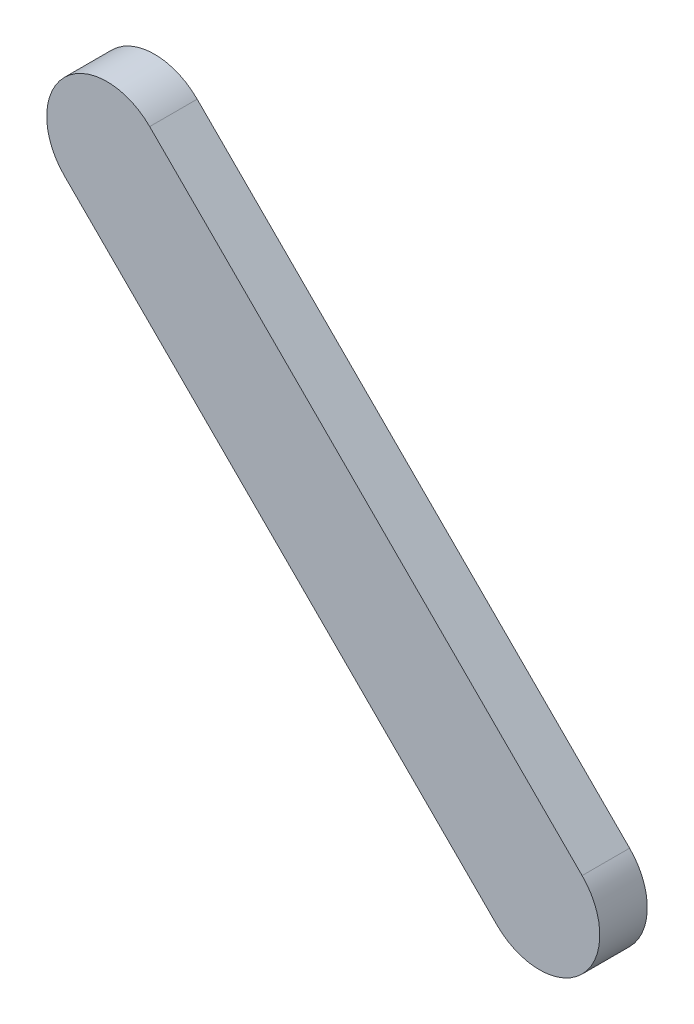
ISO-10303-21;
HEADER;
FILE_DESCRIPTION(('STEP AP214'),'2;1');
FILE_NAME('part.step','',(''),(''),'','','');
FILE_SCHEMA(('AUTOMOTIVE_DESIGN { 1 0 10303 214 1 1 1 1 }'));
ENDSEC;
DATA;
#1=APPLICATION_CONTEXT('core data for automotive mechanical design processes');
#2=APPLICATION_PROTOCOL_DEFINITION('international standard','automotive_design',2000,#1);
#3=PRODUCT_CONTEXT('',#1,'mechanical');
#4=PRODUCT('Part','Part','',(#3));
#5=PRODUCT_RELATED_PRODUCT_CATEGORY('part','',(#4));
#6=PRODUCT_DEFINITION_FORMATION('','',#4);
#7=PRODUCT_DEFINITION_CONTEXT('part definition',#1,'design');
#8=PRODUCT_DEFINITION('design','',#6,#7);
#9=PRODUCT_DEFINITION_SHAPE('','',#8);
#10=(LENGTH_UNIT() NAMED_UNIT(*) SI_UNIT(.MILLI.,.METRE.));
#11=(NAMED_UNIT(*) PLANE_ANGLE_UNIT() SI_UNIT($,.RADIAN.));
#12=(NAMED_UNIT(*) SI_UNIT($,.STERADIAN.) SOLID_ANGLE_UNIT());
#13=UNCERTAINTY_MEASURE_WITH_UNIT(LENGTH_MEASURE(1.E-05),#10,'distance_accuracy_value','');
#14=(GEOMETRIC_REPRESENTATION_CONTEXT(3) GLOBAL_UNCERTAINTY_ASSIGNED_CONTEXT((#13)) GLOBAL_UNIT_ASSIGNED_CONTEXT((#10,
#11,#12)) REPRESENTATION_CONTEXT('',''));
#15=CARTESIAN_POINT('',(0.,0.,0.));
#16=DIRECTION('',(0.,0.,1.));
#17=DIRECTION('',(1.,0.,0.));
#18=AXIS2_PLACEMENT_3D('',#15,#16,#17);
#19=CARTESIAN_POINT('',(149.36990446,79.698215,0.));
#20=DIRECTION('',(0.707106781186545,0.70710678118655,0.));
#21=DIRECTION('',(0.70710678118655,-0.707106781186545,0.));
#22=AXIS2_PLACEMENT_3D('',#19,#20,#21);
#23=PLANE('',#22);
#24=DIRECTION('',(0.70710678118655,-0.707106781186545,0.));
#25=VECTOR('',#24,1.);
#26=CARTESIAN_POINT('',(149.36990446,79.698215,0.1999996));
#27=LINE('',#26,#25);
#28=CARTESIAN_POINT('',(149.36990446,79.698215,0.1999996));
#29=VERTEX_POINT('',#28);
#30=CARTESIAN_POINT('',(151.1911378,77.87698166,0.1999996));
#31=VERTEX_POINT('',#30);
#32=EDGE_CURVE('E11',#29,#31,#27,.T.);
#33=ORIENTED_EDGE('',*,*,#32,.F.);
#34=DIRECTION('',(0.,0.,1.));
#35=VECTOR('',#34,1.);
#36=CARTESIAN_POINT('',(149.36990446,79.698215,0.));
#37=LINE('',#36,#35);
#38=CARTESIAN_POINT('',(149.36990446,79.698215,0.));
#39=VERTEX_POINT('',#38);
#40=EDGE_CURVE('E24',#39,#29,#37,.T.);
#41=ORIENTED_EDGE('',*,*,#40,.F.);
#42=DIRECTION('',(0.70710678118655,-0.707106781186545,0.));
#43=VECTOR('',#42,1.);
#44=CARTESIAN_POINT('',(149.36990446,79.698215,0.));
#45=LINE('',#44,#43);
#46=CARTESIAN_POINT('',(151.1911378,77.87698166,0.));
#47=VERTEX_POINT('',#46);
#48=EDGE_CURVE('E75',#39,#47,#45,.T.);
#49=ORIENTED_EDGE('',*,*,#48,.T.);
#50=DIRECTION('',(0.,0.,1.));
#51=VECTOR('',#50,1.);
#52=CARTESIAN_POINT('',(151.1911378,77.87698166,0.));
#53=LINE('',#52,#51);
#54=EDGE_CURVE('E37',#47,#31,#53,.T.);
#55=ORIENTED_EDGE('',*,*,#54,.T.);
#56=EDGE_LOOP('',(#33,#41,#49,#55));
#57=FACE_BOUND('',#56,.T.);
#58=ADVANCED_FACE('F17',(#57),#23,.F.);
#59=CARTESIAN_POINT('',(151.37074247,78.05658633,0.));
#60=DIRECTION('',(0.,0.,-1.));
#61=DIRECTION('',(-0.70710678118652,-0.707106781186576,0.));
#62=AXIS2_PLACEMENT_3D('',#59,#60,#61);
#63=CYLINDRICAL_SURFACE('',#62,0.253999360179536);
#64=CARTESIAN_POINT('',(151.37074247,78.05658633,0.1999996));
#65=DIRECTION('',(0.,0.,1.));
#66=DIRECTION('',(-0.70710678118652,-0.707106781186576,0.));
#67=AXIS2_PLACEMENT_3D('',#64,#65,#66);
#68=CIRCLE('',#67,0.253999360179536);
#69=CARTESIAN_POINT('',(151.55034714,78.236191,0.1999996));
#70=VERTEX_POINT('',#69);
#71=EDGE_CURVE('E83',#31,#70,#68,.T.);
#72=ORIENTED_EDGE('',*,*,#71,.F.);
#73=ORIENTED_EDGE('',*,*,#54,.F.);
#74=CARTESIAN_POINT('',(151.37074247,78.05658633,0.));
#75=DIRECTION('',(0.,0.,1.));
#76=DIRECTION('',(-0.70710678118652,-0.707106781186576,0.));
#77=AXIS2_PLACEMENT_3D('',#74,#75,#76);
#78=CIRCLE('',#77,0.253999360179536);
#79=CARTESIAN_POINT('',(151.55034714,78.236191,0.));
#80=VERTEX_POINT('',#79);
#81=EDGE_CURVE('E81',#47,#80,#78,.T.);
#82=ORIENTED_EDGE('',*,*,#81,.T.);
#83=DIRECTION('',(0.,0.,1.));
#84=VECTOR('',#83,1.);
#85=CARTESIAN_POINT('',(151.55034714,78.236191,0.));
#86=LINE('',#85,#84);
#87=EDGE_CURVE('E67',#80,#70,#86,.T.);
#88=ORIENTED_EDGE('',*,*,#87,.T.);
#89=EDGE_LOOP('',(#72,#73,#82,#88));
#90=FACE_BOUND('',#89,.T.);
#91=ADVANCED_FACE('F89',(#90),#63,.T.);
#92=CARTESIAN_POINT('',(151.55034714,78.236191,0.));
#93=DIRECTION('',(-0.70710678118655,-0.707106781186545,0.));
#94=DIRECTION('',(-0.707106781186545,0.70710678118655,0.));
#95=AXIS2_PLACEMENT_3D('',#92,#93,#94);
#96=PLANE('',#95);
#97=DIRECTION('',(-0.707106781186545,0.70710678118655,0.));
#98=VECTOR('',#97,1.);
#99=CARTESIAN_POINT('',(151.55034714,78.236191,0.1999996));
#100=LINE('',#99,#98);
#101=CARTESIAN_POINT('',(149.7291138,80.05742434,0.1999996));
#102=VERTEX_POINT('',#101);
#103=EDGE_CURVE('E71',#70,#102,#100,.T.);
#104=ORIENTED_EDGE('',*,*,#103,.F.);
#105=ORIENTED_EDGE('',*,*,#87,.F.);
#106=DIRECTION('',(-0.707106781186545,0.70710678118655,0.));
#107=VECTOR('',#106,1.);
#108=CARTESIAN_POINT('',(151.55034714,78.236191,0.));
#109=LINE('',#108,#107);
#110=CARTESIAN_POINT('',(149.7291138,80.05742434,0.));
#111=VERTEX_POINT('',#110);
#112=EDGE_CURVE('E63',#80,#111,#109,.T.);
#113=ORIENTED_EDGE('',*,*,#112,.T.);
#114=DIRECTION('',(0.,0.,1.));
#115=VECTOR('',#114,1.);
#116=CARTESIAN_POINT('',(149.7291138,80.05742434,0.));
#117=LINE('',#116,#115);
#118=EDGE_CURVE('E53',#111,#102,#117,.T.);
#119=ORIENTED_EDGE('',*,*,#118,.T.);
#120=EDGE_LOOP('',(#104,#105,#113,#119));
#121=FACE_BOUND('',#120,.T.);
#122=ADVANCED_FACE('F66',(#121),#96,.F.);
#123=CARTESIAN_POINT('',(149.54950913,79.87781967,0.));
#124=DIRECTION('',(0.,0.,-1.));
#125=DIRECTION('',(0.707106781186576,0.70710678118652,0.));
#126=AXIS2_PLACEMENT_3D('',#123,#124,#125);
#127=CYLINDRICAL_SURFACE('',#126,0.253999360179542);
#128=CARTESIAN_POINT('',(149.54950913,79.87781967,0.1999996));
#129=DIRECTION('',(0.,0.,1.));
#130=DIRECTION('',(0.707106781186576,0.70710678118652,0.));
#131=AXIS2_PLACEMENT_3D('',#128,#129,#130);
#132=CIRCLE('',#131,0.253999360179542);
#133=EDGE_CURVE('E59',#102,#29,#132,.T.);
#134=ORIENTED_EDGE('',*,*,#133,.F.);
#135=ORIENTED_EDGE('',*,*,#118,.F.);
#136=CARTESIAN_POINT('',(149.54950913,79.87781967,0.));
#137=DIRECTION('',(0.,0.,1.));
#138=DIRECTION('',(0.707106781186576,0.70710678118652,0.));
#139=AXIS2_PLACEMENT_3D('',#136,#137,#138);
#140=CIRCLE('',#139,0.253999360179542);
#141=EDGE_CURVE('E57',#111,#39,#140,.T.);
#142=ORIENTED_EDGE('',*,*,#141,.T.);
#143=ORIENTED_EDGE('',*,*,#40,.T.);
#144=EDGE_LOOP('',(#134,#135,#142,#143));
#145=FACE_BOUND('',#144,.T.);
#146=ADVANCED_FACE('F55',(#145),#127,.T.);
#147=CARTESIAN_POINT('',(149.36990446,79.698215,0.));
#148=DIRECTION('',(0.,0.,-1.));
#149=DIRECTION('',(-1.,0.,0.));
#150=AXIS2_PLACEMENT_3D('',#147,#148,#149);
#151=PLANE('',#150);
#152=ORIENTED_EDGE('',*,*,#141,.F.);
#153=ORIENTED_EDGE('',*,*,#112,.F.);
#154=ORIENTED_EDGE('',*,*,#81,.F.);
#155=ORIENTED_EDGE('',*,*,#48,.F.);
#156=EDGE_LOOP('',(#152,#153,#154,#155));
#157=FACE_BOUND('',#156,.T.);
#158=ADVANCED_FACE('F74',(#157),#151,.T.);
#159=CARTESIAN_POINT('',(149.36990446,79.698215,0.1999996));
#160=DIRECTION('',(0.,0.,-1.));
#161=DIRECTION('',(-1.,0.,0.));
#162=AXIS2_PLACEMENT_3D('',#159,#160,#161);
#163=PLANE('',#162);
#164=ORIENTED_EDGE('',*,*,#32,.T.);
#165=ORIENTED_EDGE('',*,*,#71,.T.);
#166=ORIENTED_EDGE('',*,*,#103,.T.);
#167=ORIENTED_EDGE('',*,*,#133,.T.);
#168=EDGE_LOOP('',(#164,#165,#166,#167));
#169=FACE_BOUND('',#168,.T.);
#170=ADVANCED_FACE('F91',(#169),#163,.F.);
#171=CLOSED_SHELL('',(#58,#91,#122,#146,#158,#170));
#172=MANIFOLD_SOLID_BREP('B1',#171);
#173=ADVANCED_BREP_SHAPE_REPRESENTATION('',(#18,#172),#14);
#174=SHAPE_DEFINITION_REPRESENTATION(#9,#173);
ENDSEC;
END-ISO-10303-21;
